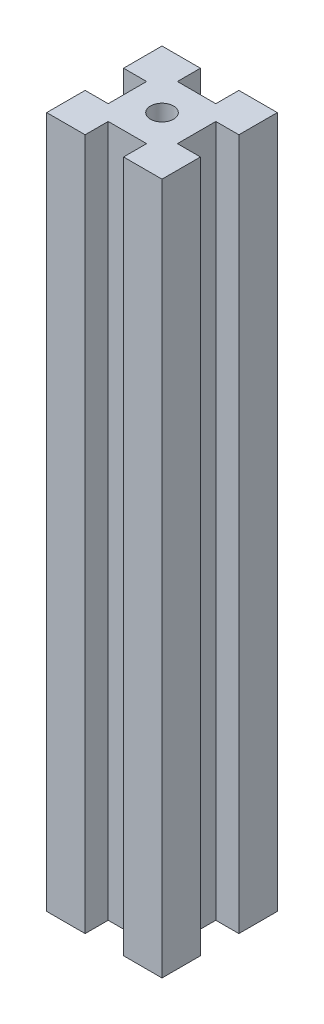
ISO-10303-21;
HEADER;
FILE_DESCRIPTION(('STEP AP214'),'2;1');
FILE_NAME('part.step','',(''),(''),'','','');
FILE_SCHEMA(('AUTOMOTIVE_DESIGN { 1 0 10303 214 1 1 1 1 }'));
ENDSEC;
DATA;
#1=APPLICATION_CONTEXT('core data for automotive mechanical design processes');
#2=APPLICATION_PROTOCOL_DEFINITION('international standard','automotive_design',2000,#1);
#3=PRODUCT_CONTEXT('',#1,'mechanical');
#4=PRODUCT('Part','Part','',(#3));
#5=PRODUCT_RELATED_PRODUCT_CATEGORY('part','',(#4));
#6=PRODUCT_DEFINITION_FORMATION('','',#4);
#7=PRODUCT_DEFINITION_CONTEXT('part definition',#1,'design');
#8=PRODUCT_DEFINITION('design','',#6,#7);
#9=PRODUCT_DEFINITION_SHAPE('','',#8);
#10=(LENGTH_UNIT() NAMED_UNIT(*) SI_UNIT(.MILLI.,.METRE.));
#11=(NAMED_UNIT(*) PLANE_ANGLE_UNIT() SI_UNIT($,.RADIAN.));
#12=(NAMED_UNIT(*) SI_UNIT($,.STERADIAN.) SOLID_ANGLE_UNIT());
#13=UNCERTAINTY_MEASURE_WITH_UNIT(LENGTH_MEASURE(1.E-05),#10,'distance_accuracy_value','');
#14=(GEOMETRIC_REPRESENTATION_CONTEXT(3) GLOBAL_UNCERTAINTY_ASSIGNED_CONTEXT((#13)) GLOBAL_UNIT_ASSIGNED_CONTEXT((#10,
#11,#12)) REPRESENTATION_CONTEXT('',''));
#15=CARTESIAN_POINT('',(0.,0.,0.));
#16=DIRECTION('',(0.,0.,1.));
#17=DIRECTION('',(1.,0.,0.));
#18=AXIS2_PLACEMENT_3D('',#15,#16,#17);
#19=CARTESIAN_POINT('',(0.,90.,0.));
#20=DIRECTION('',(0.,1.,0.));
#21=DIRECTION('',(0.,0.,1.));
#22=AXIS2_PLACEMENT_3D('',#19,#20,#21);
#23=PLANE('',#22);
#24=DIRECTION('',(1.,0.,0.));
#25=VECTOR('',#24,1.);
#26=CARTESIAN_POINT('',(2.5,90.,4.50000000000001));
#27=LINE('',#26,#25);
#28=CARTESIAN_POINT('',(-2.5,90.,4.50000000000001));
#29=VERTEX_POINT('',#28);
#30=CARTESIAN_POINT('',(2.5,90.,4.50000000000001));
#31=VERTEX_POINT('',#30);
#32=EDGE_CURVE('E247',#29,#31,#27,.T.);
#33=ORIENTED_EDGE('',*,*,#32,.T.);
#34=DIRECTION('',(0.,0.,1.));
#35=VECTOR('',#34,1.);
#36=CARTESIAN_POINT('',(2.5,90.,4.50000000000001));
#37=LINE('',#36,#35);
#38=CARTESIAN_POINT('',(2.5,90.,7.50000000000001));
#39=VERTEX_POINT('',#38);
#40=EDGE_CURVE('E135',#31,#39,#37,.T.);
#41=ORIENTED_EDGE('',*,*,#40,.T.);
#42=DIRECTION('',(1.,0.,0.));
#43=VECTOR('',#42,1.);
#44=CARTESIAN_POINT('',(2.5,90.,7.50000000000001));
#45=LINE('',#44,#43);
#46=CARTESIAN_POINT('',(7.5,90.,7.50000000000001));
#47=VERTEX_POINT('',#46);
#48=EDGE_CURVE('E298',#39,#47,#45,.T.);
#49=ORIENTED_EDGE('',*,*,#48,.T.);
#50=DIRECTION('',(0.,0.,-1.));
#51=VECTOR('',#50,1.);
#52=CARTESIAN_POINT('',(7.5,90.,7.50000000000001));
#53=LINE('',#52,#51);
#54=CARTESIAN_POINT('',(7.5,90.,2.50000000000001));
#55=VERTEX_POINT('',#54);
#56=EDGE_CURVE('E317',#47,#55,#53,.T.);
#57=ORIENTED_EDGE('',*,*,#56,.T.);
#58=DIRECTION('',(-1.,0.,0.));
#59=VECTOR('',#58,1.);
#60=CARTESIAN_POINT('',(7.5,90.,2.50000000000001));
#61=LINE('',#60,#59);
#62=CARTESIAN_POINT('',(4.5,90.,2.50000000000001));
#63=VERTEX_POINT('',#62);
#64=EDGE_CURVE('E314',#55,#63,#61,.T.);
#65=ORIENTED_EDGE('',*,*,#64,.T.);
#66=DIRECTION('',(0.,0.,-1.));
#67=VECTOR('',#66,1.);
#68=CARTESIAN_POINT('',(4.5,90.,-2.50000000000001));
#69=LINE('',#68,#67);
#70=CARTESIAN_POINT('',(4.5,90.,-2.50000000000001));
#71=VERTEX_POINT('',#70);
#72=EDGE_CURVE('E316',#63,#71,#69,.T.);
#73=ORIENTED_EDGE('',*,*,#72,.T.);
#74=DIRECTION('',(1.,0.,0.));
#75=VECTOR('',#74,1.);
#76=CARTESIAN_POINT('',(7.5,90.,-2.50000000000001));
#77=LINE('',#76,#75);
#78=CARTESIAN_POINT('',(7.5,90.,-2.50000000000001));
#79=VERTEX_POINT('',#78);
#80=EDGE_CURVE('E319',#71,#79,#77,.T.);
#81=ORIENTED_EDGE('',*,*,#80,.T.);
#82=DIRECTION('',(0.,0.,-1.));
#83=VECTOR('',#82,1.);
#84=CARTESIAN_POINT('',(7.5,90.,-7.50000000000001));
#85=LINE('',#84,#83);
#86=CARTESIAN_POINT('',(7.5,90.,-7.50000000000001));
#87=VERTEX_POINT('',#86);
#88=EDGE_CURVE('E325',#79,#87,#85,.T.);
#89=ORIENTED_EDGE('',*,*,#88,.T.);
#90=DIRECTION('',(-1.,0.,0.));
#91=VECTOR('',#90,1.);
#92=CARTESIAN_POINT('',(2.5,90.,-7.50000000000001));
#93=LINE('',#92,#91);
#94=CARTESIAN_POINT('',(2.5,90.,-7.50000000000001));
#95=VERTEX_POINT('',#94);
#96=EDGE_CURVE('E327',#87,#95,#93,.T.);
#97=ORIENTED_EDGE('',*,*,#96,.T.);
#98=DIRECTION('',(0.,0.,1.));
#99=VECTOR('',#98,1.);
#100=CARTESIAN_POINT('',(2.5,90.,-4.50000000000001));
#101=LINE('',#100,#99);
#102=CARTESIAN_POINT('',(2.5,90.,-4.50000000000001));
#103=VERTEX_POINT('',#102);
#104=EDGE_CURVE('E329',#95,#103,#101,.T.);
#105=ORIENTED_EDGE('',*,*,#104,.T.);
#106=DIRECTION('',(-1.,0.,0.));
#107=VECTOR('',#106,1.);
#108=CARTESIAN_POINT('',(2.5,90.,-4.50000000000001));
#109=LINE('',#108,#107);
#110=CARTESIAN_POINT('',(-2.5,90.,-4.50000000000001));
#111=VERTEX_POINT('',#110);
#112=EDGE_CURVE('E331',#103,#111,#109,.T.);
#113=ORIENTED_EDGE('',*,*,#112,.T.);
#114=DIRECTION('',(0.,0.,-1.));
#115=VECTOR('',#114,1.);
#116=CARTESIAN_POINT('',(-2.5,90.,-4.50000000000001));
#117=LINE('',#116,#115);
#118=CARTESIAN_POINT('',(-2.5,90.,-7.50000000000001));
#119=VERTEX_POINT('',#118);
#120=EDGE_CURVE('E333',#111,#119,#117,.T.);
#121=ORIENTED_EDGE('',*,*,#120,.T.);
#122=DIRECTION('',(-1.,0.,0.));
#123=VECTOR('',#122,1.);
#124=CARTESIAN_POINT('',(-2.5,90.,-7.50000000000001));
#125=LINE('',#124,#123);
#126=CARTESIAN_POINT('',(-7.5,90.,-7.50000000000001));
#127=VERTEX_POINT('',#126);
#128=EDGE_CURVE('E335',#119,#127,#125,.T.);
#129=ORIENTED_EDGE('',*,*,#128,.T.);
#130=DIRECTION('',(0.,0.,1.));
#131=VECTOR('',#130,1.);
#132=CARTESIAN_POINT('',(-7.5,90.,-7.50000000000001));
#133=LINE('',#132,#131);
#134=CARTESIAN_POINT('',(-7.5,90.,-2.50000000000001));
#135=VERTEX_POINT('',#134);
#136=EDGE_CURVE('E337',#127,#135,#133,.T.);
#137=ORIENTED_EDGE('',*,*,#136,.T.);
#138=DIRECTION('',(1.,0.,0.));
#139=VECTOR('',#138,1.);
#140=CARTESIAN_POINT('',(-7.5,90.,-2.50000000000001));
#141=LINE('',#140,#139);
#142=CARTESIAN_POINT('',(-4.5,90.,-2.50000000000001));
#143=VERTEX_POINT('',#142);
#144=EDGE_CURVE('E339',#135,#143,#141,.T.);
#145=ORIENTED_EDGE('',*,*,#144,.T.);
#146=DIRECTION('',(0.,0.,1.));
#147=VECTOR('',#146,1.);
#148=CARTESIAN_POINT('',(-4.5,90.,-2.50000000000001));
#149=LINE('',#148,#147);
#150=CARTESIAN_POINT('',(-4.5,90.,2.50000000000001));
#151=VERTEX_POINT('',#150);
#152=EDGE_CURVE('E341',#143,#151,#149,.T.);
#153=ORIENTED_EDGE('',*,*,#152,.T.);
#154=DIRECTION('',(-1.,0.,0.));
#155=VECTOR('',#154,1.);
#156=CARTESIAN_POINT('',(-7.5,90.,2.50000000000001));
#157=LINE('',#156,#155);
#158=CARTESIAN_POINT('',(-7.5,90.,2.50000000000001));
#159=VERTEX_POINT('',#158);
#160=EDGE_CURVE('E190',#151,#159,#157,.T.);
#161=ORIENTED_EDGE('',*,*,#160,.T.);
#162=DIRECTION('',(0.,0.,1.));
#163=VECTOR('',#162,1.);
#164=CARTESIAN_POINT('',(-7.5,90.,7.50000000000001));
#165=LINE('',#164,#163);
#166=CARTESIAN_POINT('',(-7.5,90.,7.50000000000001));
#167=VERTEX_POINT('',#166);
#168=EDGE_CURVE('E184',#159,#167,#165,.T.);
#169=ORIENTED_EDGE('',*,*,#168,.T.);
#170=DIRECTION('',(1.,0.,0.));
#171=VECTOR('',#170,1.);
#172=CARTESIAN_POINT('',(-2.5,90.,7.50000000000001));
#173=LINE('',#172,#171);
#174=CARTESIAN_POINT('',(-2.5,90.,7.50000000000001));
#175=VERTEX_POINT('',#174);
#176=EDGE_CURVE('E188',#167,#175,#173,.T.);
#177=ORIENTED_EDGE('',*,*,#176,.T.);
#178=DIRECTION('',(0.,0.,-1.));
#179=VECTOR('',#178,1.);
#180=CARTESIAN_POINT('',(-2.5,90.,4.50000000000001));
#181=LINE('',#180,#179);
#182=EDGE_CURVE('E56',#175,#29,#181,.T.);
#183=ORIENTED_EDGE('',*,*,#182,.T.);
#184=EDGE_LOOP('',(#33,#41,#49,#57,#65,#73,#81,#89,#97,#105,#113,#121,#129,#137,#145,#153,#161,
#169,#177,#183));
#185=FACE_BOUND('',#184,.T.);
#186=CARTESIAN_POINT('',(0.,90.,0.));
#187=DIRECTION('',(0.,1.,0.));
#188=DIRECTION('',(0.,0.,1.));
#189=AXIS2_PLACEMENT_3D('',#186,#187,#188);
#190=CIRCLE('',#189,1.5);
#191=CARTESIAN_POINT('',(0.,90.,-1.5));
#192=VERTEX_POINT('',#191);
#193=EDGE_CURVE('E212',#192,#192,#190,.T.);
#194=ORIENTED_EDGE('',*,*,#193,.F.);
#195=EDGE_LOOP('',(#194));
#196=FACE_BOUND('',#195,.T.);
#197=ADVANCED_FACE('F39',(#185,#196),#23,.T.);
#198=CARTESIAN_POINT('',(0.,0.,0.));
#199=DIRECTION('',(0.,1.,0.));
#200=DIRECTION('',(0.,0.,1.));
#201=AXIS2_PLACEMENT_3D('',#198,#199,#200);
#202=PLANE('',#201);
#203=DIRECTION('',(1.,0.,0.));
#204=VECTOR('',#203,1.);
#205=CARTESIAN_POINT('',(2.5,0.,4.50000000000001));
#206=LINE('',#205,#204);
#207=CARTESIAN_POINT('',(-2.5,0.,4.50000000000001));
#208=VERTEX_POINT('',#207);
#209=CARTESIAN_POINT('',(2.5,0.,4.50000000000001));
#210=VERTEX_POINT('',#209);
#211=EDGE_CURVE('E208',#208,#210,#206,.T.);
#212=ORIENTED_EDGE('',*,*,#211,.F.);
#213=DIRECTION('',(0.,0.,-1.));
#214=VECTOR('',#213,1.);
#215=CARTESIAN_POINT('',(-2.5,0.,4.50000000000001));
#216=LINE('',#215,#214);
#217=CARTESIAN_POINT('',(-2.5,0.,7.50000000000001));
#218=VERTEX_POINT('',#217);
#219=EDGE_CURVE('E127',#218,#208,#216,.T.);
#220=ORIENTED_EDGE('',*,*,#219,.F.);
#221=DIRECTION('',(1.,0.,0.));
#222=VECTOR('',#221,1.);
#223=CARTESIAN_POINT('',(-2.5,0.,7.50000000000001));
#224=LINE('',#223,#222);
#225=CARTESIAN_POINT('',(-7.5,0.,7.50000000000001));
#226=VERTEX_POINT('',#225);
#227=EDGE_CURVE('E121',#226,#218,#224,.T.);
#228=ORIENTED_EDGE('',*,*,#227,.F.);
#229=DIRECTION('',(0.,0.,1.));
#230=VECTOR('',#229,1.);
#231=CARTESIAN_POINT('',(-7.5,0.,7.50000000000001));
#232=LINE('',#231,#230);
#233=CARTESIAN_POINT('',(-7.5,0.,2.50000000000001));
#234=VERTEX_POINT('',#233);
#235=EDGE_CURVE('E198',#234,#226,#232,.T.);
#236=ORIENTED_EDGE('',*,*,#235,.F.);
#237=DIRECTION('',(-1.,0.,0.));
#238=VECTOR('',#237,1.);
#239=CARTESIAN_POINT('',(-7.5,0.,2.50000000000001));
#240=LINE('',#239,#238);
#241=CARTESIAN_POINT('',(-4.5,0.,2.50000000000001));
#242=VERTEX_POINT('',#241);
#243=EDGE_CURVE('E242',#242,#234,#240,.T.);
#244=ORIENTED_EDGE('',*,*,#243,.F.);
#245=DIRECTION('',(0.,0.,1.));
#246=VECTOR('',#245,1.);
#247=CARTESIAN_POINT('',(-4.5,0.,-2.50000000000001));
#248=LINE('',#247,#246);
#249=CARTESIAN_POINT('',(-4.5,0.,-2.50000000000001));
#250=VERTEX_POINT('',#249);
#251=EDGE_CURVE('E240',#250,#242,#248,.T.);
#252=ORIENTED_EDGE('',*,*,#251,.F.);
#253=DIRECTION('',(1.,0.,0.));
#254=VECTOR('',#253,1.);
#255=CARTESIAN_POINT('',(-7.5,0.,-2.50000000000001));
#256=LINE('',#255,#254);
#257=CARTESIAN_POINT('',(-7.5,0.,-2.50000000000001));
#258=VERTEX_POINT('',#257);
#259=EDGE_CURVE('E238',#258,#250,#256,.T.);
#260=ORIENTED_EDGE('',*,*,#259,.F.);
#261=DIRECTION('',(0.,0.,1.));
#262=VECTOR('',#261,1.);
#263=CARTESIAN_POINT('',(-7.5,0.,-7.50000000000001));
#264=LINE('',#263,#262);
#265=CARTESIAN_POINT('',(-7.5,0.,-7.50000000000001));
#266=VERTEX_POINT('',#265);
#267=EDGE_CURVE('E236',#266,#258,#264,.T.);
#268=ORIENTED_EDGE('',*,*,#267,.F.);
#269=DIRECTION('',(-1.,0.,0.));
#270=VECTOR('',#269,1.);
#271=CARTESIAN_POINT('',(-2.5,0.,-7.50000000000001));
#272=LINE('',#271,#270);
#273=CARTESIAN_POINT('',(-2.5,0.,-7.50000000000001));
#274=VERTEX_POINT('',#273);
#275=EDGE_CURVE('E234',#274,#266,#272,.T.);
#276=ORIENTED_EDGE('',*,*,#275,.F.);
#277=DIRECTION('',(0.,0.,-1.));
#278=VECTOR('',#277,1.);
#279=CARTESIAN_POINT('',(-2.5,0.,-4.50000000000001));
#280=LINE('',#279,#278);
#281=CARTESIAN_POINT('',(-2.5,0.,-4.50000000000001));
#282=VERTEX_POINT('',#281);
#283=EDGE_CURVE('E232',#282,#274,#280,.T.);
#284=ORIENTED_EDGE('',*,*,#283,.F.);
#285=DIRECTION('',(-1.,0.,0.));
#286=VECTOR('',#285,1.);
#287=CARTESIAN_POINT('',(2.5,0.,-4.50000000000001));
#288=LINE('',#287,#286);
#289=CARTESIAN_POINT('',(2.5,0.,-4.50000000000001));
#290=VERTEX_POINT('',#289);
#291=EDGE_CURVE('E230',#290,#282,#288,.T.);
#292=ORIENTED_EDGE('',*,*,#291,.F.);
#293=DIRECTION('',(0.,0.,1.));
#294=VECTOR('',#293,1.);
#295=CARTESIAN_POINT('',(2.5,0.,-4.50000000000001));
#296=LINE('',#295,#294);
#297=CARTESIAN_POINT('',(2.5,0.,-7.50000000000001));
#298=VERTEX_POINT('',#297);
#299=EDGE_CURVE('E228',#298,#290,#296,.T.);
#300=ORIENTED_EDGE('',*,*,#299,.F.);
#301=DIRECTION('',(-1.,0.,0.));
#302=VECTOR('',#301,1.);
#303=CARTESIAN_POINT('',(2.5,0.,-7.50000000000001));
#304=LINE('',#303,#302);
#305=CARTESIAN_POINT('',(7.5,0.,-7.50000000000001));
#306=VERTEX_POINT('',#305);
#307=EDGE_CURVE('E226',#306,#298,#304,.T.);
#308=ORIENTED_EDGE('',*,*,#307,.F.);
#309=DIRECTION('',(0.,0.,-1.));
#310=VECTOR('',#309,1.);
#311=CARTESIAN_POINT('',(7.5,0.,-7.50000000000001));
#312=LINE('',#311,#310);
#313=CARTESIAN_POINT('',(7.5,0.,-2.50000000000001));
#314=VERTEX_POINT('',#313);
#315=EDGE_CURVE('E224',#314,#306,#312,.T.);
#316=ORIENTED_EDGE('',*,*,#315,.F.);
#317=DIRECTION('',(1.,0.,0.));
#318=VECTOR('',#317,1.);
#319=CARTESIAN_POINT('',(7.5,0.,-2.50000000000001));
#320=LINE('',#319,#318);
#321=CARTESIAN_POINT('',(4.5,0.,-2.50000000000001));
#322=VERTEX_POINT('',#321);
#323=EDGE_CURVE('E222',#322,#314,#320,.T.);
#324=ORIENTED_EDGE('',*,*,#323,.F.);
#325=DIRECTION('',(0.,0.,-1.));
#326=VECTOR('',#325,1.);
#327=CARTESIAN_POINT('',(4.5,0.,-2.50000000000001));
#328=LINE('',#327,#326);
#329=CARTESIAN_POINT('',(4.5,0.,2.50000000000001));
#330=VERTEX_POINT('',#329);
#331=EDGE_CURVE('E220',#330,#322,#328,.T.);
#332=ORIENTED_EDGE('',*,*,#331,.F.);
#333=DIRECTION('',(-1.,0.,0.));
#334=VECTOR('',#333,1.);
#335=CARTESIAN_POINT('',(7.5,0.,2.50000000000001));
#336=LINE('',#335,#334);
#337=CARTESIAN_POINT('',(7.5,0.,2.50000000000001));
#338=VERTEX_POINT('',#337);
#339=EDGE_CURVE('E218',#338,#330,#336,.T.);
#340=ORIENTED_EDGE('',*,*,#339,.F.);
#341=DIRECTION('',(0.,0.,-1.));
#342=VECTOR('',#341,1.);
#343=CARTESIAN_POINT('',(7.5,0.,7.50000000000001));
#344=LINE('',#343,#342);
#345=CARTESIAN_POINT('',(7.5,0.,7.50000000000001));
#346=VERTEX_POINT('',#345);
#347=EDGE_CURVE('E216',#346,#338,#344,.T.);
#348=ORIENTED_EDGE('',*,*,#347,.F.);
#349=DIRECTION('',(1.,0.,0.));
#350=VECTOR('',#349,1.);
#351=CARTESIAN_POINT('',(2.5,0.,7.50000000000001));
#352=LINE('',#351,#350);
#353=CARTESIAN_POINT('',(2.5,0.,7.50000000000001));
#354=VERTEX_POINT('',#353);
#355=EDGE_CURVE('E214',#354,#346,#352,.T.);
#356=ORIENTED_EDGE('',*,*,#355,.F.);
#357=DIRECTION('',(0.,0.,1.));
#358=VECTOR('',#357,1.);
#359=CARTESIAN_POINT('',(2.5,0.,4.50000000000001));
#360=LINE('',#359,#358);
#361=EDGE_CURVE('E211',#210,#354,#360,.T.);
#362=ORIENTED_EDGE('',*,*,#361,.F.);
#363=EDGE_LOOP('',(#212,#220,#228,#236,#244,#252,#260,#268,#276,#284,#292,#300,#308,#316,#324,
#332,#340,#348,#356,#362));
#364=FACE_BOUND('',#363,.T.);
#365=CARTESIAN_POINT('',(0.,0.,0.));
#366=DIRECTION('',(0.,1.,0.));
#367=DIRECTION('',(0.,0.,1.));
#368=AXIS2_PLACEMENT_3D('',#365,#366,#367);
#369=CIRCLE('',#368,1.5);
#370=CARTESIAN_POINT('',(0.,0.,-1.5));
#371=VERTEX_POINT('',#370);
#372=EDGE_CURVE('E592',#371,#371,#369,.T.);
#373=ORIENTED_EDGE('',*,*,#372,.T.);
#374=EDGE_LOOP('',(#373));
#375=FACE_BOUND('',#374,.T.);
#376=ADVANCED_FACE('F302',(#364,#375),#202,.F.);
#377=CARTESIAN_POINT('',(2.5,90.,4.50000000000001));
#378=DIRECTION('',(0.,0.,-1.));
#379=DIRECTION('',(-1.,0.,0.));
#380=AXIS2_PLACEMENT_3D('',#377,#378,#379);
#381=PLANE('',#380);
#382=ORIENTED_EDGE('',*,*,#211,.T.);
#383=DIRECTION('',(0.,-1.,0.));
#384=VECTOR('',#383,1.);
#385=CARTESIAN_POINT('',(2.5,90.,4.50000000000001));
#386=LINE('',#385,#384);
#387=EDGE_CURVE('E11',#31,#210,#386,.T.);
#388=ORIENTED_EDGE('',*,*,#387,.F.);
#389=ORIENTED_EDGE('',*,*,#32,.F.);
#390=DIRECTION('',(0.,-1.,0.));
#391=VECTOR('',#390,1.);
#392=CARTESIAN_POINT('',(-2.5,90.,4.50000000000001));
#393=LINE('',#392,#391);
#394=EDGE_CURVE('E204',#29,#208,#393,.T.);
#395=ORIENTED_EDGE('',*,*,#394,.T.);
#396=EDGE_LOOP('',(#382,#388,#389,#395));
#397=FACE_BOUND('',#396,.T.);
#398=ADVANCED_FACE('F41',(#397),#381,.F.);
#399=CARTESIAN_POINT('',(2.5,90.,4.50000000000001));
#400=DIRECTION('',(1.,0.,0.));
#401=DIRECTION('',(0.,0.,-1.));
#402=AXIS2_PLACEMENT_3D('',#399,#400,#401);
#403=PLANE('',#402);
#404=ORIENTED_EDGE('',*,*,#361,.T.);
#405=DIRECTION('',(0.,-1.,0.));
#406=VECTOR('',#405,1.);
#407=CARTESIAN_POINT('',(2.5,90.,7.50000000000001));
#408=LINE('',#407,#406);
#409=EDGE_CURVE('E48',#39,#354,#408,.T.);
#410=ORIENTED_EDGE('',*,*,#409,.F.);
#411=ORIENTED_EDGE('',*,*,#40,.F.);
#412=ORIENTED_EDGE('',*,*,#387,.T.);
#413=EDGE_LOOP('',(#404,#410,#411,#412));
#414=FACE_BOUND('',#413,.T.);
#415=ADVANCED_FACE('F375',(#414),#403,.F.);
#416=CARTESIAN_POINT('',(2.5,90.,7.50000000000001));
#417=DIRECTION('',(0.,0.,-1.));
#418=DIRECTION('',(-1.,0.,0.));
#419=AXIS2_PLACEMENT_3D('',#416,#417,#418);
#420=PLANE('',#419);
#421=ORIENTED_EDGE('',*,*,#355,.T.);
#422=DIRECTION('',(0.,-1.,0.));
#423=VECTOR('',#422,1.);
#424=CARTESIAN_POINT('',(7.5,90.,7.50000000000001));
#425=LINE('',#424,#423);
#426=EDGE_CURVE('E290',#47,#346,#425,.T.);
#427=ORIENTED_EDGE('',*,*,#426,.F.);
#428=ORIENTED_EDGE('',*,*,#48,.F.);
#429=ORIENTED_EDGE('',*,*,#409,.T.);
#430=EDGE_LOOP('',(#421,#427,#428,#429));
#431=FACE_BOUND('',#430,.T.);
#432=ADVANCED_FACE('F296',(#431),#420,.F.);
#433=CARTESIAN_POINT('',(7.5,90.,7.50000000000001));
#434=DIRECTION('',(-1.,0.,0.));
#435=DIRECTION('',(0.,0.,1.));
#436=AXIS2_PLACEMENT_3D('',#433,#434,#435);
#437=PLANE('',#436);
#438=ORIENTED_EDGE('',*,*,#347,.T.);
#439=DIRECTION('',(0.,-1.,0.));
#440=VECTOR('',#439,1.);
#441=CARTESIAN_POINT('',(7.5,90.,2.50000000000001));
#442=LINE('',#441,#440);
#443=EDGE_CURVE('E287',#55,#338,#442,.T.);
#444=ORIENTED_EDGE('',*,*,#443,.F.);
#445=ORIENTED_EDGE('',*,*,#56,.F.);
#446=ORIENTED_EDGE('',*,*,#426,.T.);
#447=EDGE_LOOP('',(#438,#444,#445,#446));
#448=FACE_BOUND('',#447,.T.);
#449=ADVANCED_FACE('F308',(#448),#437,.F.);
#450=CARTESIAN_POINT('',(7.5,90.,2.50000000000001));
#451=DIRECTION('',(0.,0.,1.));
#452=DIRECTION('',(1.,0.,0.));
#453=AXIS2_PLACEMENT_3D('',#450,#451,#452);
#454=PLANE('',#453);
#455=ORIENTED_EDGE('',*,*,#339,.T.);
#456=DIRECTION('',(0.,-1.,0.));
#457=VECTOR('',#456,1.);
#458=CARTESIAN_POINT('',(4.5,90.,2.50000000000001));
#459=LINE('',#458,#457);
#460=EDGE_CURVE('E284',#63,#330,#459,.T.);
#461=ORIENTED_EDGE('',*,*,#460,.F.);
#462=ORIENTED_EDGE('',*,*,#64,.F.);
#463=ORIENTED_EDGE('',*,*,#443,.T.);
#464=EDGE_LOOP('',(#455,#461,#462,#463));
#465=FACE_BOUND('',#464,.T.);
#466=ADVANCED_FACE('F312',(#465),#454,.F.);
#467=CARTESIAN_POINT('',(4.5,90.,-2.50000000000001));
#468=DIRECTION('',(-1.,0.,0.));
#469=DIRECTION('',(0.,0.,1.));
#470=AXIS2_PLACEMENT_3D('',#467,#468,#469);
#471=PLANE('',#470);
#472=ORIENTED_EDGE('',*,*,#331,.T.);
#473=DIRECTION('',(0.,-1.,0.));
#474=VECTOR('',#473,1.);
#475=CARTESIAN_POINT('',(4.5,90.,-2.50000000000001));
#476=LINE('',#475,#474);
#477=EDGE_CURVE('E281',#71,#322,#476,.T.);
#478=ORIENTED_EDGE('',*,*,#477,.F.);
#479=ORIENTED_EDGE('',*,*,#72,.F.);
#480=ORIENTED_EDGE('',*,*,#460,.T.);
#481=EDGE_LOOP('',(#472,#478,#479,#480));
#482=FACE_BOUND('',#481,.T.);
#483=ADVANCED_FACE('F388',(#482),#471,.F.);
#484=CARTESIAN_POINT('',(7.5,90.,-2.50000000000001));
#485=DIRECTION('',(0.,0.,-1.));
#486=DIRECTION('',(-1.,0.,0.));
#487=AXIS2_PLACEMENT_3D('',#484,#485,#486);
#488=PLANE('',#487);
#489=ORIENTED_EDGE('',*,*,#323,.T.);
#490=DIRECTION('',(0.,-1.,0.));
#491=VECTOR('',#490,1.);
#492=CARTESIAN_POINT('',(7.5,90.,-2.50000000000001));
#493=LINE('',#492,#491);
#494=EDGE_CURVE('E278',#79,#314,#493,.T.);
#495=ORIENTED_EDGE('',*,*,#494,.F.);
#496=ORIENTED_EDGE('',*,*,#80,.F.);
#497=ORIENTED_EDGE('',*,*,#477,.T.);
#498=EDGE_LOOP('',(#489,#495,#496,#497));
#499=FACE_BOUND('',#498,.T.);
#500=ADVANCED_FACE('F391',(#499),#488,.F.);
#501=CARTESIAN_POINT('',(7.5,90.,-7.50000000000001));
#502=DIRECTION('',(-1.,0.,0.));
#503=DIRECTION('',(0.,0.,1.));
#504=AXIS2_PLACEMENT_3D('',#501,#502,#503);
#505=PLANE('',#504);
#506=ORIENTED_EDGE('',*,*,#315,.T.);
#507=DIRECTION('',(0.,-1.,0.));
#508=VECTOR('',#507,1.);
#509=CARTESIAN_POINT('',(7.5,90.,-7.50000000000001));
#510=LINE('',#509,#508);
#511=EDGE_CURVE('E275',#87,#306,#510,.T.);
#512=ORIENTED_EDGE('',*,*,#511,.F.);
#513=ORIENTED_EDGE('',*,*,#88,.F.);
#514=ORIENTED_EDGE('',*,*,#494,.T.);
#515=EDGE_LOOP('',(#506,#512,#513,#514));
#516=FACE_BOUND('',#515,.T.);
#517=ADVANCED_FACE('F395',(#516),#505,.F.);
#518=CARTESIAN_POINT('',(2.5,90.,-7.50000000000001));
#519=DIRECTION('',(0.,0.,1.));
#520=DIRECTION('',(1.,0.,0.));
#521=AXIS2_PLACEMENT_3D('',#518,#519,#520);
#522=PLANE('',#521);
#523=ORIENTED_EDGE('',*,*,#307,.T.);
#524=DIRECTION('',(0.,-1.,0.));
#525=VECTOR('',#524,1.);
#526=CARTESIAN_POINT('',(2.5,90.,-7.50000000000001));
#527=LINE('',#526,#525);
#528=EDGE_CURVE('E272',#95,#298,#527,.T.);
#529=ORIENTED_EDGE('',*,*,#528,.F.);
#530=ORIENTED_EDGE('',*,*,#96,.F.);
#531=ORIENTED_EDGE('',*,*,#511,.T.);
#532=EDGE_LOOP('',(#523,#529,#530,#531));
#533=FACE_BOUND('',#532,.T.);
#534=ADVANCED_FACE('F399',(#533),#522,.F.);
#535=CARTESIAN_POINT('',(2.5,90.,-4.50000000000001));
#536=DIRECTION('',(1.,0.,0.));
#537=DIRECTION('',(0.,0.,-1.));
#538=AXIS2_PLACEMENT_3D('',#535,#536,#537);
#539=PLANE('',#538);
#540=ORIENTED_EDGE('',*,*,#299,.T.);
#541=DIRECTION('',(0.,-1.,0.));
#542=VECTOR('',#541,1.);
#543=CARTESIAN_POINT('',(2.5,90.,-4.50000000000001));
#544=LINE('',#543,#542);
#545=EDGE_CURVE('E269',#103,#290,#544,.T.);
#546=ORIENTED_EDGE('',*,*,#545,.F.);
#547=ORIENTED_EDGE('',*,*,#104,.F.);
#548=ORIENTED_EDGE('',*,*,#528,.T.);
#549=EDGE_LOOP('',(#540,#546,#547,#548));
#550=FACE_BOUND('',#549,.T.);
#551=ADVANCED_FACE('F403',(#550),#539,.F.);
#552=CARTESIAN_POINT('',(2.5,90.,-4.50000000000001));
#553=DIRECTION('',(0.,0.,1.));
#554=DIRECTION('',(1.,0.,0.));
#555=AXIS2_PLACEMENT_3D('',#552,#553,#554);
#556=PLANE('',#555);
#557=ORIENTED_EDGE('',*,*,#291,.T.);
#558=DIRECTION('',(0.,-1.,0.));
#559=VECTOR('',#558,1.);
#560=CARTESIAN_POINT('',(-2.5,90.,-4.50000000000001));
#561=LINE('',#560,#559);
#562=EDGE_CURVE('E266',#111,#282,#561,.T.);
#563=ORIENTED_EDGE('',*,*,#562,.F.);
#564=ORIENTED_EDGE('',*,*,#112,.F.);
#565=ORIENTED_EDGE('',*,*,#545,.T.);
#566=EDGE_LOOP('',(#557,#563,#564,#565));
#567=FACE_BOUND('',#566,.T.);
#568=ADVANCED_FACE('F407',(#567),#556,.F.);
#569=CARTESIAN_POINT('',(-2.5,90.,-4.50000000000001));
#570=DIRECTION('',(-1.,0.,0.));
#571=DIRECTION('',(0.,0.,1.));
#572=AXIS2_PLACEMENT_3D('',#569,#570,#571);
#573=PLANE('',#572);
#574=ORIENTED_EDGE('',*,*,#283,.T.);
#575=DIRECTION('',(0.,-1.,0.));
#576=VECTOR('',#575,1.);
#577=CARTESIAN_POINT('',(-2.5,90.,-7.50000000000001));
#578=LINE('',#577,#576);
#579=EDGE_CURVE('E263',#119,#274,#578,.T.);
#580=ORIENTED_EDGE('',*,*,#579,.F.);
#581=ORIENTED_EDGE('',*,*,#120,.F.);
#582=ORIENTED_EDGE('',*,*,#562,.T.);
#583=EDGE_LOOP('',(#574,#580,#581,#582));
#584=FACE_BOUND('',#583,.T.);
#585=ADVANCED_FACE('F411',(#584),#573,.F.);
#586=CARTESIAN_POINT('',(-2.5,90.,-7.50000000000001));
#587=DIRECTION('',(0.,0.,1.));
#588=DIRECTION('',(1.,0.,0.));
#589=AXIS2_PLACEMENT_3D('',#586,#587,#588);
#590=PLANE('',#589);
#591=ORIENTED_EDGE('',*,*,#275,.T.);
#592=DIRECTION('',(0.,-1.,0.));
#593=VECTOR('',#592,1.);
#594=CARTESIAN_POINT('',(-7.5,90.,-7.50000000000001));
#595=LINE('',#594,#593);
#596=EDGE_CURVE('E260',#127,#266,#595,.T.);
#597=ORIENTED_EDGE('',*,*,#596,.F.);
#598=ORIENTED_EDGE('',*,*,#128,.F.);
#599=ORIENTED_EDGE('',*,*,#579,.T.);
#600=EDGE_LOOP('',(#591,#597,#598,#599));
#601=FACE_BOUND('',#600,.T.);
#602=ADVANCED_FACE('F415',(#601),#590,.F.);
#603=CARTESIAN_POINT('',(-7.5,90.,-7.50000000000001));
#604=DIRECTION('',(1.,0.,0.));
#605=DIRECTION('',(0.,0.,-1.));
#606=AXIS2_PLACEMENT_3D('',#603,#604,#605);
#607=PLANE('',#606);
#608=ORIENTED_EDGE('',*,*,#267,.T.);
#609=DIRECTION('',(0.,-1.,0.));
#610=VECTOR('',#609,1.);
#611=CARTESIAN_POINT('',(-7.5,90.,-2.50000000000001));
#612=LINE('',#611,#610);
#613=EDGE_CURVE('E257',#135,#258,#612,.T.);
#614=ORIENTED_EDGE('',*,*,#613,.F.);
#615=ORIENTED_EDGE('',*,*,#136,.F.);
#616=ORIENTED_EDGE('',*,*,#596,.T.);
#617=EDGE_LOOP('',(#608,#614,#615,#616));
#618=FACE_BOUND('',#617,.T.);
#619=ADVANCED_FACE('F419',(#618),#607,.F.);
#620=CARTESIAN_POINT('',(-7.5,90.,-2.50000000000001));
#621=DIRECTION('',(0.,0.,-1.));
#622=DIRECTION('',(-1.,0.,0.));
#623=AXIS2_PLACEMENT_3D('',#620,#621,#622);
#624=PLANE('',#623);
#625=ORIENTED_EDGE('',*,*,#259,.T.);
#626=DIRECTION('',(0.,-1.,0.));
#627=VECTOR('',#626,1.);
#628=CARTESIAN_POINT('',(-4.5,90.,-2.50000000000001));
#629=LINE('',#628,#627);
#630=EDGE_CURVE('E254',#143,#250,#629,.T.);
#631=ORIENTED_EDGE('',*,*,#630,.F.);
#632=ORIENTED_EDGE('',*,*,#144,.F.);
#633=ORIENTED_EDGE('',*,*,#613,.T.);
#634=EDGE_LOOP('',(#625,#631,#632,#633));
#635=FACE_BOUND('',#634,.T.);
#636=ADVANCED_FACE('F423',(#635),#624,.F.);
#637=CARTESIAN_POINT('',(-4.5,90.,-2.50000000000001));
#638=DIRECTION('',(1.,0.,0.));
#639=DIRECTION('',(0.,0.,-1.));
#640=AXIS2_PLACEMENT_3D('',#637,#638,#639);
#641=PLANE('',#640);
#642=ORIENTED_EDGE('',*,*,#251,.T.);
#643=DIRECTION('',(0.,-1.,0.));
#644=VECTOR('',#643,1.);
#645=CARTESIAN_POINT('',(-4.5,90.,2.50000000000001));
#646=LINE('',#645,#644);
#647=EDGE_CURVE('E251',#151,#242,#646,.T.);
#648=ORIENTED_EDGE('',*,*,#647,.F.);
#649=ORIENTED_EDGE('',*,*,#152,.F.);
#650=ORIENTED_EDGE('',*,*,#630,.T.);
#651=EDGE_LOOP('',(#642,#648,#649,#650));
#652=FACE_BOUND('',#651,.T.);
#653=ADVANCED_FACE('F347',(#652),#641,.F.);
#654=CARTESIAN_POINT('',(-7.5,90.,2.50000000000001));
#655=DIRECTION('',(0.,0.,1.));
#656=DIRECTION('',(1.,0.,0.));
#657=AXIS2_PLACEMENT_3D('',#654,#655,#656);
#658=PLANE('',#657);
#659=ORIENTED_EDGE('',*,*,#243,.T.);
#660=DIRECTION('',(0.,-1.,0.));
#661=VECTOR('',#660,1.);
#662=CARTESIAN_POINT('',(-7.5,90.,2.50000000000001));
#663=LINE('',#662,#661);
#664=EDGE_CURVE('E199',#159,#234,#663,.T.);
#665=ORIENTED_EDGE('',*,*,#664,.F.);
#666=ORIENTED_EDGE('',*,*,#160,.F.);
#667=ORIENTED_EDGE('',*,*,#647,.T.);
#668=EDGE_LOOP('',(#659,#665,#666,#667));
#669=FACE_BOUND('',#668,.T.);
#670=ADVANCED_FACE('F351',(#669),#658,.F.);
#671=CARTESIAN_POINT('',(-7.5,90.,7.50000000000001));
#672=DIRECTION('',(1.,0.,0.));
#673=DIRECTION('',(0.,0.,-1.));
#674=AXIS2_PLACEMENT_3D('',#671,#672,#673);
#675=PLANE('',#674);
#676=ORIENTED_EDGE('',*,*,#235,.T.);
#677=DIRECTION('',(0.,-1.,0.));
#678=VECTOR('',#677,1.);
#679=CARTESIAN_POINT('',(-7.5,90.,7.50000000000001));
#680=LINE('',#679,#678);
#681=EDGE_CURVE('E195',#167,#226,#680,.T.);
#682=ORIENTED_EDGE('',*,*,#681,.F.);
#683=ORIENTED_EDGE('',*,*,#168,.F.);
#684=ORIENTED_EDGE('',*,*,#664,.T.);
#685=EDGE_LOOP('',(#676,#682,#683,#684));
#686=FACE_BOUND('',#685,.T.);
#687=ADVANCED_FACE('F196',(#686),#675,.F.);
#688=CARTESIAN_POINT('',(-2.5,90.,7.50000000000001));
#689=DIRECTION('',(0.,0.,-1.));
#690=DIRECTION('',(-1.,0.,0.));
#691=AXIS2_PLACEMENT_3D('',#688,#689,#690);
#692=PLANE('',#691);
#693=ORIENTED_EDGE('',*,*,#227,.T.);
#694=DIRECTION('',(0.,-1.,0.));
#695=VECTOR('',#694,1.);
#696=CARTESIAN_POINT('',(-2.5,90.,7.50000000000001));
#697=LINE('',#696,#695);
#698=EDGE_CURVE('E200',#175,#218,#697,.T.);
#699=ORIENTED_EDGE('',*,*,#698,.F.);
#700=ORIENTED_EDGE('',*,*,#176,.F.);
#701=ORIENTED_EDGE('',*,*,#681,.T.);
#702=EDGE_LOOP('',(#693,#699,#700,#701));
#703=FACE_BOUND('',#702,.T.);
#704=ADVANCED_FACE('F202',(#703),#692,.F.);
#705=CARTESIAN_POINT('',(-2.5,90.,4.50000000000001));
#706=DIRECTION('',(-1.,0.,0.));
#707=DIRECTION('',(0.,0.,1.));
#708=AXIS2_PLACEMENT_3D('',#705,#706,#707);
#709=PLANE('',#708);
#710=ORIENTED_EDGE('',*,*,#219,.T.);
#711=ORIENTED_EDGE('',*,*,#394,.F.);
#712=ORIENTED_EDGE('',*,*,#182,.F.);
#713=ORIENTED_EDGE('',*,*,#698,.T.);
#714=EDGE_LOOP('',(#710,#711,#712,#713));
#715=FACE_BOUND('',#714,.T.);
#716=ADVANCED_FACE('F355',(#715),#709,.F.);
#717=CARTESIAN_POINT('',(0.,90.,0.));
#718=DIRECTION('',(0.,-1.,0.));
#719=DIRECTION('',(0.,0.,-1.));
#720=AXIS2_PLACEMENT_3D('',#717,#718,#719);
#721=CYLINDRICAL_SURFACE('',#720,1.5);
#722=CARTESIAN_POINT('',(0.,90.,-1.5));
#723=CARTESIAN_POINT('',(0.,89.0625,-1.5));
#724=CARTESIAN_POINT('',(0.,88.125,-1.5));
#725=CARTESIAN_POINT('',(0.,86.25,-1.5));
#726=CARTESIAN_POINT('',(0.,85.3125,-1.5));
#727=CARTESIAN_POINT('',(0.,83.4375,-1.5));
#728=CARTESIAN_POINT('',(0.,82.5,-1.5));
#729=CARTESIAN_POINT('',(0.,80.625,-1.5));
#730=CARTESIAN_POINT('',(0.,79.6875,-1.5));
#731=CARTESIAN_POINT('',(0.,77.8125,-1.5));
#732=CARTESIAN_POINT('',(0.,76.875,-1.5));
#733=CARTESIAN_POINT('',(0.,75.,-1.5));
#734=CARTESIAN_POINT('',(0.,74.0625,-1.5));
#735=CARTESIAN_POINT('',(0.,72.1875,-1.5));
#736=CARTESIAN_POINT('',(0.,71.25,-1.5));
#737=CARTESIAN_POINT('',(0.,69.375,-1.5));
#738=CARTESIAN_POINT('',(0.,68.4375,-1.5));
#739=CARTESIAN_POINT('',(0.,66.5625,-1.5));
#740=CARTESIAN_POINT('',(0.,65.625,-1.5));
#741=CARTESIAN_POINT('',(0.,63.75,-1.5));
#742=CARTESIAN_POINT('',(0.,62.8125,-1.5));
#743=CARTESIAN_POINT('',(0.,60.9375,-1.5));
#744=CARTESIAN_POINT('',(0.,60.,-1.5));
#745=CARTESIAN_POINT('',(0.,58.125,-1.5));
#746=CARTESIAN_POINT('',(0.,57.1875,-1.5));
#747=CARTESIAN_POINT('',(0.,55.3125,-1.5));
#748=CARTESIAN_POINT('',(0.,54.375,-1.5));
#749=CARTESIAN_POINT('',(0.,52.5,-1.5));
#750=CARTESIAN_POINT('',(0.,51.5625,-1.5));
#751=CARTESIAN_POINT('',(0.,49.6875,-1.5));
#752=CARTESIAN_POINT('',(0.,48.75,-1.5));
#753=CARTESIAN_POINT('',(0.,46.875,-1.5));
#754=CARTESIAN_POINT('',(0.,45.9375,-1.5));
#755=CARTESIAN_POINT('',(0.,44.0625,-1.5));
#756=CARTESIAN_POINT('',(0.,43.125,-1.5));
#757=CARTESIAN_POINT('',(0.,41.25,-1.5));
#758=CARTESIAN_POINT('',(0.,40.3125,-1.5));
#759=CARTESIAN_POINT('',(0.,38.4375,-1.5));
#760=CARTESIAN_POINT('',(0.,37.5,-1.5));
#761=CARTESIAN_POINT('',(0.,35.625,-1.5));
#762=CARTESIAN_POINT('',(0.,34.6875,-1.5));
#763=CARTESIAN_POINT('',(0.,32.8125,-1.5));
#764=CARTESIAN_POINT('',(0.,31.875,-1.5));
#765=CARTESIAN_POINT('',(0.,30.,-1.5));
#766=CARTESIAN_POINT('',(0.,29.0625,-1.5));
#767=CARTESIAN_POINT('',(0.,27.1875,-1.5));
#768=CARTESIAN_POINT('',(0.,26.25,-1.5));
#769=CARTESIAN_POINT('',(0.,24.375,-1.5));
#770=CARTESIAN_POINT('',(0.,23.4375,-1.5));
#771=CARTESIAN_POINT('',(0.,21.5625,-1.5));
#772=CARTESIAN_POINT('',(0.,20.625,-1.5));
#773=CARTESIAN_POINT('',(0.,18.75,-1.5));
#774=CARTESIAN_POINT('',(0.,17.8125,-1.5));
#775=CARTESIAN_POINT('',(0.,15.9375,-1.5));
#776=CARTESIAN_POINT('',(0.,15.,-1.5));
#777=CARTESIAN_POINT('',(0.,13.125,-1.5));
#778=CARTESIAN_POINT('',(0.,12.1875,-1.5));
#779=CARTESIAN_POINT('',(0.,10.3125,-1.5));
#780=CARTESIAN_POINT('',(0.,9.37499999999999,-1.5));
#781=CARTESIAN_POINT('',(0.,7.49999999999999,-1.5));
#782=CARTESIAN_POINT('',(0.,6.56249999999999,-1.5));
#783=CARTESIAN_POINT('',(0.,4.68749999999999,-1.5));
#784=CARTESIAN_POINT('',(0.,3.74999999999998,-1.5));
#785=CARTESIAN_POINT('',(0.,1.87499999999998,-1.5));
#786=CARTESIAN_POINT('',(0.,0.937499999999986,-1.5));
#787=CARTESIAN_POINT('',(0.,0.,-1.5));
#788=B_SPLINE_CURVE_WITH_KNOTS('',3,(#722,#723,#724,#725,#726,#727,#728,#729,#730,#731,#732,
#733,#734,#735,#736,#737,#738,#739,#740,#741,#742,#743,#744,#745,#746,#747,#748,#749,#750,#751,
#752,#753,#754,#755,#756,#757,#758,#759,#760,#761,#762,#763,#764,#765,#766,#767,#768,#769,#770,
#771,#772,#773,#774,#775,#776,#777,#778,#779,#780,#781,#782,#783,#784,#785,#786,#787),
.UNSPECIFIED.,.F.,.F.,(4,2,2,2,2,2,2,2,2,2,2,2,2,2,2,2,2,2,2,2,2,2,2,2,2,2,2,2,2,2,2,2,4),(0.,
2.81250000000001,5.62500000000001,8.43750000000001,11.25,14.0625,16.875,19.6875,22.5,25.3125,
28.125,30.9375,33.75,36.5625,39.375,42.1875,45.,47.8125,50.625,53.4375,56.25,59.0625,61.875,
64.6875,67.5,70.3125,73.125,75.9375,78.75,81.5625,84.375,87.1875,90.),.UNSPECIFIED.);
#789=EDGE_CURVE('BSEAM357',#192,#371,#788,.T.);
#790=ORIENTED_EDGE('',*,*,#193,.T.);
#791=ORIENTED_EDGE('',*,*,#372,.F.);
#792=ORIENTED_EDGE('',*,*,#789,.T.);
#793=ORIENTED_EDGE('',*,*,#789,.F.);
#794=EDGE_LOOP('',(#790,#792,#791,#793));
#795=FACE_BOUND('',#794,.T.);
#796=ADVANCED_FACE('F357',(#795),#721,.F.);
#797=CLOSED_SHELL('',(#197,#376,#398,#415,#432,#449,#466,#483,#500,#517,#534,#551,#568,#585,
#602,#619,#636,#653,#670,#687,#704,#716,#796));
#798=MANIFOLD_SOLID_BREP('B2',#797);
#799=ADVANCED_BREP_SHAPE_REPRESENTATION('',(#18,#798),#14);
#800=SHAPE_DEFINITION_REPRESENTATION(#9,#799);
ENDSEC;
END-ISO-10303-21;
